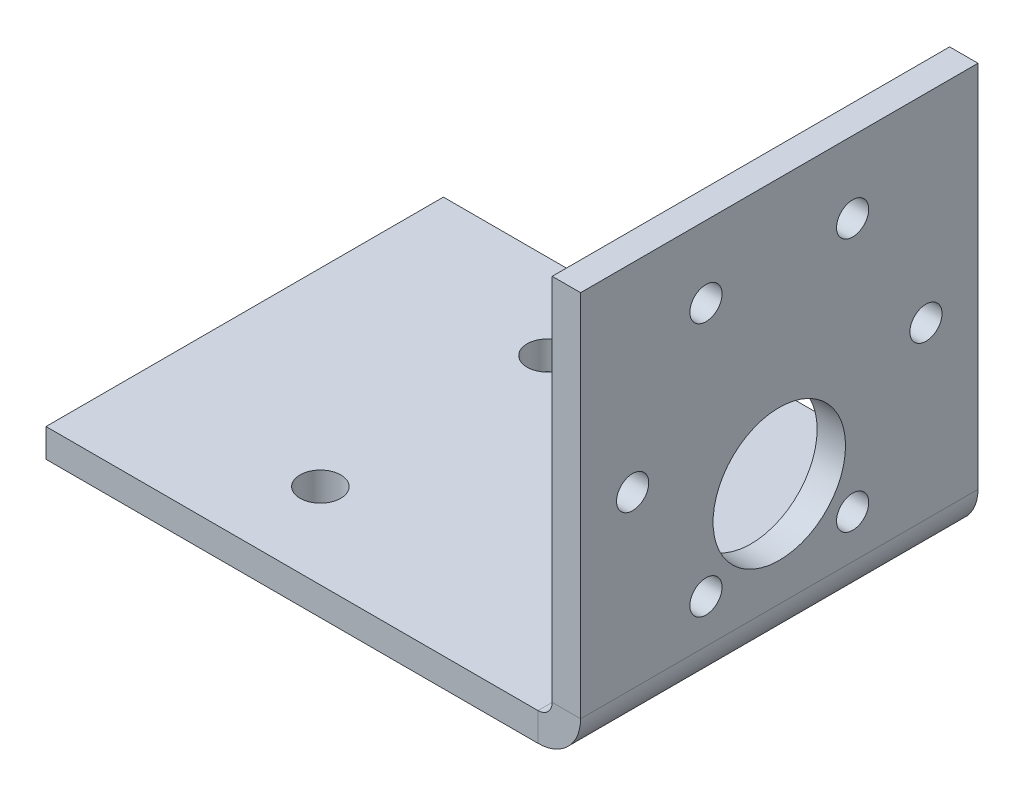
ISO-10303-21;
HEADER;
FILE_DESCRIPTION(('STEP AP214'),'2;1');
FILE_NAME('part.step','',(''),(''),'','','');
FILE_SCHEMA(('AUTOMOTIVE_DESIGN { 1 0 10303 214 1 1 1 1 }'));
ENDSEC;
DATA;
#1=APPLICATION_CONTEXT('core data for automotive mechanical design processes');
#2=APPLICATION_PROTOCOL_DEFINITION('international standard','automotive_design',2000,#1);
#3=PRODUCT_CONTEXT('',#1,'mechanical');
#4=PRODUCT('Part','Part','',(#3));
#5=PRODUCT_RELATED_PRODUCT_CATEGORY('part','',(#4));
#6=PRODUCT_DEFINITION_FORMATION('','',#4);
#7=PRODUCT_DEFINITION_CONTEXT('part definition',#1,'design');
#8=PRODUCT_DEFINITION('design','',#6,#7);
#9=PRODUCT_DEFINITION_SHAPE('','',#8);
#10=(LENGTH_UNIT() NAMED_UNIT(*) SI_UNIT(.MILLI.,.METRE.));
#11=(NAMED_UNIT(*) PLANE_ANGLE_UNIT() SI_UNIT($,.RADIAN.));
#12=(NAMED_UNIT(*) SI_UNIT($,.STERADIAN.) SOLID_ANGLE_UNIT());
#13=UNCERTAINTY_MEASURE_WITH_UNIT(LENGTH_MEASURE(1.E-05),#10,'distance_accuracy_value','');
#14=(GEOMETRIC_REPRESENTATION_CONTEXT(3) GLOBAL_UNCERTAINTY_ASSIGNED_CONTEXT((#13)) GLOBAL_UNIT_ASSIGNED_CONTEXT((#10,
#11,#12)) REPRESENTATION_CONTEXT('',''));
#15=CARTESIAN_POINT('',(0.,0.,0.));
#16=DIRECTION('',(0.,0.,1.));
#17=DIRECTION('',(1.,0.,0.));
#18=AXIS2_PLACEMENT_3D('',#15,#16,#17);
#19=CARTESIAN_POINT('',(0.,-18.,21.));
#20=DIRECTION('',(0.,0.,1.));
#21=DIRECTION('',(1.,0.,0.));
#22=AXIS2_PLACEMENT_3D('',#19,#20,#21);
#23=PLANE('',#22);
#24=DIRECTION('',(1.,0.,0.));
#25=VECTOR('',#24,1.);
#26=CARTESIAN_POINT('',(0.,-18.,21.));
#27=LINE('',#26,#25);
#28=CARTESIAN_POINT('',(0.,-18.,21.));
#29=VERTEX_POINT('',#28);
#30=CARTESIAN_POINT('',(3.,-18.,21.));
#31=VERTEX_POINT('',#30);
#32=EDGE_CURVE('E11',#29,#31,#27,.T.);
#33=ORIENTED_EDGE('',*,*,#32,.F.);
#34=CARTESIAN_POINT('',(-1.5,-18.,21.));
#35=DIRECTION('',(0.,0.,1.));
#36=DIRECTION('',(1.,0.,0.));
#37=AXIS2_PLACEMENT_3D('',#34,#35,#36);
#38=CIRCLE('',#37,1.5);
#39=CARTESIAN_POINT('',(-1.5,-19.5,21.));
#40=VERTEX_POINT('',#39);
#41=EDGE_CURVE('E173',#29,#40,#38,.F.);
#42=ORIENTED_EDGE('',*,*,#41,.T.);
#43=DIRECTION('',(0.,1.,0.));
#44=VECTOR('',#43,1.);
#45=CARTESIAN_POINT('',(-1.5,-22.5,21.));
#46=LINE('',#45,#44);
#47=CARTESIAN_POINT('',(-1.5,-22.5,21.));
#48=VERTEX_POINT('',#47);
#49=EDGE_CURVE('E51',#48,#40,#46,.T.);
#50=ORIENTED_EDGE('',*,*,#49,.F.);
#51=CARTESIAN_POINT('',(-1.5,-18.,21.));
#52=DIRECTION('',(0.,0.,1.));
#53=DIRECTION('',(1.,0.,0.));
#54=AXIS2_PLACEMENT_3D('',#51,#52,#53);
#55=CIRCLE('',#54,4.5);
#56=EDGE_CURVE('E162',#31,#48,#55,.F.);
#57=ORIENTED_EDGE('',*,*,#56,.F.);
#58=EDGE_LOOP('',(#33,#42,#50,#57));
#59=FACE_BOUND('',#58,.T.);
#60=ADVANCED_FACE('F43',(#59),#23,.T.);
#61=CARTESIAN_POINT('',(-1.5,-22.5,21.));
#62=DIRECTION('',(0.,0.,1.));
#63=DIRECTION('',(1.,0.,0.));
#64=AXIS2_PLACEMENT_3D('',#61,#62,#63);
#65=PLANE('',#64);
#66=DIRECTION('',(0.,-1.,0.));
#67=VECTOR('',#66,1.);
#68=CARTESIAN_POINT('',(0.,21.,21.));
#69=LINE('',#68,#67);
#70=CARTESIAN_POINT('',(0.,21.,21.));
#71=VERTEX_POINT('',#70);
#72=EDGE_CURVE('E171',#71,#29,#69,.T.);
#73=ORIENTED_EDGE('',*,*,#72,.T.);
#74=ORIENTED_EDGE('',*,*,#32,.T.);
#75=DIRECTION('',(0.,1.,0.));
#76=VECTOR('',#75,1.);
#77=CARTESIAN_POINT('',(3.,21.,21.));
#78=LINE('',#77,#76);
#79=CARTESIAN_POINT('',(3.,21.,21.));
#80=VERTEX_POINT('',#79);
#81=EDGE_CURVE('E164',#80,#31,#78,.F.);
#82=ORIENTED_EDGE('',*,*,#81,.F.);
#83=DIRECTION('',(1.,0.,0.));
#84=VECTOR('',#83,1.);
#85=CARTESIAN_POINT('',(0.,21.,21.));
#86=LINE('',#85,#84);
#87=EDGE_CURVE('E166',#71,#80,#86,.T.);
#88=ORIENTED_EDGE('',*,*,#87,.F.);
#89=EDGE_LOOP('',(#73,#74,#82,#88));
#90=FACE_BOUND('',#89,.T.);
#91=ADVANCED_FACE('F290',(#90),#65,.T.);
#92=CARTESIAN_POINT('',(-1.5,-19.5,-21.0001));
#93=DIRECTION('',(0.,0.,-1.));
#94=DIRECTION('',(-1.,0.,0.));
#95=AXIS2_PLACEMENT_3D('',#92,#93,#94);
#96=PLANE('',#95);
#97=DIRECTION('',(0.,-1.,0.));
#98=VECTOR('',#97,1.);
#99=CARTESIAN_POINT('',(-1.5,-19.5,-21.0001));
#100=LINE('',#99,#98);
#101=CARTESIAN_POINT('',(-1.5,-19.5,-21.0001));
#102=VERTEX_POINT('',#101);
#103=CARTESIAN_POINT('',(-1.5,-22.5,-21.0001));
#104=VERTEX_POINT('',#103);
#105=EDGE_CURVE('E192',#102,#104,#100,.T.);
#106=ORIENTED_EDGE('',*,*,#105,.F.);
#107=CARTESIAN_POINT('',(-1.5,-18.,-21.0001));
#108=DIRECTION('',(0.,0.,1.));
#109=DIRECTION('',(1.,0.,0.));
#110=AXIS2_PLACEMENT_3D('',#107,#108,#109);
#111=CIRCLE('',#110,1.5);
#112=CARTESIAN_POINT('',(0.,-18.,-21.0001));
#113=VERTEX_POINT('',#112);
#114=EDGE_CURVE('E155',#113,#102,#111,.F.);
#115=ORIENTED_EDGE('',*,*,#114,.F.);
#116=DIRECTION('',(-1.,0.,0.));
#117=VECTOR('',#116,1.);
#118=CARTESIAN_POINT('',(3.,-18.,-21.0001));
#119=LINE('',#118,#117);
#120=CARTESIAN_POINT('',(3.,-18.,-21.0001));
#121=VERTEX_POINT('',#120);
#122=EDGE_CURVE('E116',#121,#113,#119,.T.);
#123=ORIENTED_EDGE('',*,*,#122,.F.);
#124=CARTESIAN_POINT('',(-1.5,-18.,-21.0001));
#125=DIRECTION('',(0.,0.,1.));
#126=DIRECTION('',(1.,0.,0.));
#127=AXIS2_PLACEMENT_3D('',#124,#125,#126);
#128=CIRCLE('',#127,4.5);
#129=EDGE_CURVE('E145',#121,#104,#128,.F.);
#130=ORIENTED_EDGE('',*,*,#129,.T.);
#131=EDGE_LOOP('',(#106,#115,#123,#130));
#132=FACE_BOUND('',#131,.T.);
#133=ADVANCED_FACE('F275',(#132),#96,.T.);
#134=CARTESIAN_POINT('',(3.,-18.,-21.0001));
#135=DIRECTION('',(0.,0.,-1.));
#136=DIRECTION('',(-1.,0.,0.));
#137=AXIS2_PLACEMENT_3D('',#134,#135,#136);
#138=PLANE('',#137);
#139=DIRECTION('',(-1.,0.,0.));
#140=VECTOR('',#139,1.);
#141=CARTESIAN_POINT('',(0.,-19.5,-21.0001));
#142=LINE('',#141,#140);
#143=CARTESIAN_POINT('',(-53.5,-19.5,-21.0001));
#144=VERTEX_POINT('',#143);
#145=EDGE_CURVE('E124',#102,#144,#142,.T.);
#146=ORIENTED_EDGE('',*,*,#145,.F.);
#147=ORIENTED_EDGE('',*,*,#105,.T.);
#148=DIRECTION('',(1.,0.,0.));
#149=VECTOR('',#148,1.);
#150=CARTESIAN_POINT('',(0.,-22.5,-21.0001));
#151=LINE('',#150,#149);
#152=CARTESIAN_POINT('',(-53.5,-22.5,-21.0001));
#153=VERTEX_POINT('',#152);
#154=EDGE_CURVE('E127',#104,#153,#151,.F.);
#155=ORIENTED_EDGE('',*,*,#154,.T.);
#156=DIRECTION('',(0.,1.,0.));
#157=VECTOR('',#156,1.);
#158=CARTESIAN_POINT('',(-53.5,-22.5,-21.0001));
#159=LINE('',#158,#157);
#160=EDGE_CURVE('E109',#153,#144,#159,.T.);
#161=ORIENTED_EDGE('',*,*,#160,.T.);
#162=EDGE_LOOP('',(#146,#147,#155,#161));
#163=FACE_BOUND('',#162,.T.);
#164=ADVANCED_FACE('F125',(#163),#138,.T.);
#165=CARTESIAN_POINT('',(0.,-19.5,21.));
#166=DIRECTION('',(0.,-1.,0.));
#167=DIRECTION('',(0.,0.,-1.));
#168=AXIS2_PLACEMENT_3D('',#165,#166,#167);
#169=PLANE('',#168);
#170=CARTESIAN_POINT('',(-33.5,-19.5,12.));
#171=DIRECTION('',(0.,-1.,0.));
#172=DIRECTION('',(0.,0.,-1.));
#173=AXIS2_PLACEMENT_3D('',#170,#171,#172);
#174=CIRCLE('',#173,2.15);
#175=CARTESIAN_POINT('',(-33.5,-19.5,14.15));
#176=VERTEX_POINT('',#175);
#177=EDGE_CURVE('E204',#176,#176,#174,.T.);
#178=ORIENTED_EDGE('',*,*,#177,.T.);
#179=EDGE_LOOP('',(#178));
#180=FACE_BOUND('',#179,.T.);
#181=CARTESIAN_POINT('',(-33.5,-19.5,-12.));
#182=DIRECTION('',(0.,-1.,0.));
#183=DIRECTION('',(0.,0.,-1.));
#184=AXIS2_PLACEMENT_3D('',#181,#182,#183);
#185=CIRCLE('',#184,2.15);
#186=CARTESIAN_POINT('',(-33.5,-19.5,-9.85));
#187=VERTEX_POINT('',#186);
#188=EDGE_CURVE('E193',#187,#187,#185,.T.);
#189=ORIENTED_EDGE('',*,*,#188,.T.);
#190=EDGE_LOOP('',(#189));
#191=FACE_BOUND('',#190,.T.);
#192=DIRECTION('',(0.,0.,-1.));
#193=VECTOR('',#192,1.);
#194=CARTESIAN_POINT('',(-1.5,-19.5,21.));
#195=LINE('',#194,#193);
#196=EDGE_CURVE('E131',#40,#102,#195,.T.);
#197=ORIENTED_EDGE('',*,*,#196,.T.);
#198=ORIENTED_EDGE('',*,*,#145,.T.);
#199=DIRECTION('',(0.,0.,-1.));
#200=VECTOR('',#199,1.);
#201=CARTESIAN_POINT('',(-53.5,-19.5,21.));
#202=LINE('',#201,#200);
#203=CARTESIAN_POINT('',(-53.5,-19.5,21.));
#204=VERTEX_POINT('',#203);
#205=EDGE_CURVE('E110',#204,#144,#202,.T.);
#206=ORIENTED_EDGE('',*,*,#205,.F.);
#207=DIRECTION('',(-1.,0.,0.));
#208=VECTOR('',#207,1.);
#209=CARTESIAN_POINT('',(0.,-19.5,21.));
#210=LINE('',#209,#208);
#211=EDGE_CURVE('E158',#40,#204,#210,.T.);
#212=ORIENTED_EDGE('',*,*,#211,.F.);
#213=EDGE_LOOP('',(#197,#198,#206,#212));
#214=FACE_BOUND('',#213,.T.);
#215=ADVANCED_FACE('F126',(#180,#191,#214),#169,.F.);
#216=CARTESIAN_POINT('',(-53.5,-22.5,21.));
#217=DIRECTION('',(-1.,0.,0.));
#218=DIRECTION('',(0.,0.,1.));
#219=AXIS2_PLACEMENT_3D('',#216,#217,#218);
#220=PLANE('',#219);
#221=ORIENTED_EDGE('',*,*,#205,.T.);
#222=ORIENTED_EDGE('',*,*,#160,.F.);
#223=DIRECTION('',(0.,0.,-1.));
#224=VECTOR('',#223,1.);
#225=CARTESIAN_POINT('',(-53.5,-22.5,21.));
#226=LINE('',#225,#224);
#227=CARTESIAN_POINT('',(-53.5,-22.5,21.));
#228=VERTEX_POINT('',#227);
#229=EDGE_CURVE('E120',#228,#153,#226,.T.);
#230=ORIENTED_EDGE('',*,*,#229,.F.);
#231=DIRECTION('',(0.,1.,0.));
#232=VECTOR('',#231,1.);
#233=CARTESIAN_POINT('',(-53.5,-22.5,21.));
#234=LINE('',#233,#232);
#235=EDGE_CURVE('E115',#228,#204,#234,.T.);
#236=ORIENTED_EDGE('',*,*,#235,.T.);
#237=EDGE_LOOP('',(#221,#222,#230,#236));
#238=FACE_BOUND('',#237,.T.);
#239=ADVANCED_FACE('F107',(#238),#220,.T.);
#240=CARTESIAN_POINT('',(0.,-22.5,21.));
#241=DIRECTION('',(0.,-1.,0.));
#242=DIRECTION('',(0.,0.,-1.));
#243=AXIS2_PLACEMENT_3D('',#240,#241,#242);
#244=PLANE('',#243);
#245=CARTESIAN_POINT('',(-33.5,-22.5,12.));
#246=DIRECTION('',(0.,-1.,0.));
#247=DIRECTION('',(0.,0.,-1.));
#248=AXIS2_PLACEMENT_3D('',#245,#246,#247);
#249=CIRCLE('',#248,2.15);
#250=CARTESIAN_POINT('',(-33.5,-22.5,14.15));
#251=VERTEX_POINT('',#250);
#252=EDGE_CURVE('E46',#251,#251,#249,.T.);
#253=ORIENTED_EDGE('',*,*,#252,.F.);
#254=EDGE_LOOP('',(#253));
#255=FACE_BOUND('',#254,.T.);
#256=CARTESIAN_POINT('',(-33.5,-22.5,-12.));
#257=DIRECTION('',(0.,-1.,0.));
#258=DIRECTION('',(0.,0.,-1.));
#259=AXIS2_PLACEMENT_3D('',#256,#257,#258);
#260=CIRCLE('',#259,2.15);
#261=CARTESIAN_POINT('',(-33.5,-22.5,-9.85));
#262=VERTEX_POINT('',#261);
#263=EDGE_CURVE('E194',#262,#262,#260,.T.);
#264=ORIENTED_EDGE('',*,*,#263,.F.);
#265=EDGE_LOOP('',(#264));
#266=FACE_BOUND('',#265,.T.);
#267=ORIENTED_EDGE('',*,*,#229,.T.);
#268=ORIENTED_EDGE('',*,*,#154,.F.);
#269=DIRECTION('',(0.,0.,-1.));
#270=VECTOR('',#269,1.);
#271=CARTESIAN_POINT('',(-1.5,-22.5,21.));
#272=LINE('',#271,#270);
#273=EDGE_CURVE('E187',#48,#104,#272,.T.);
#274=ORIENTED_EDGE('',*,*,#273,.F.);
#275=DIRECTION('',(1.,0.,0.));
#276=VECTOR('',#275,1.);
#277=CARTESIAN_POINT('',(0.,-22.5,21.));
#278=LINE('',#277,#276);
#279=EDGE_CURVE('E159',#48,#228,#278,.F.);
#280=ORIENTED_EDGE('',*,*,#279,.T.);
#281=EDGE_LOOP('',(#267,#268,#274,#280));
#282=FACE_BOUND('',#281,.T.);
#283=ADVANCED_FACE('F273',(#255,#266,#282),#244,.T.);
#284=CARTESIAN_POINT('',(-1.5,-18.,21.));
#285=DIRECTION('',(0.,0.,-1.));
#286=DIRECTION('',(-1.,0.,0.));
#287=AXIS2_PLACEMENT_3D('',#284,#285,#286);
#288=CYLINDRICAL_SURFACE('',#287,4.5);
#289=ORIENTED_EDGE('',*,*,#273,.T.);
#290=ORIENTED_EDGE('',*,*,#129,.F.);
#291=DIRECTION('',(0.,0.,-1.));
#292=VECTOR('',#291,1.);
#293=CARTESIAN_POINT('',(3.,-18.,21.));
#294=LINE('',#293,#292);
#295=EDGE_CURVE('E182',#31,#121,#294,.T.);
#296=ORIENTED_EDGE('',*,*,#295,.F.);
#297=ORIENTED_EDGE('',*,*,#56,.T.);
#298=EDGE_LOOP('',(#289,#290,#296,#297));
#299=FACE_BOUND('',#298,.T.);
#300=ADVANCED_FACE('F255',(#299),#288,.T.);
#301=CARTESIAN_POINT('',(3.,21.,21.));
#302=DIRECTION('',(1.,0.,0.));
#303=DIRECTION('',(0.,0.,-1.));
#304=AXIS2_PLACEMENT_3D('',#301,#302,#303);
#305=PLANE('',#304);
#306=CARTESIAN_POINT('',(3.,0.,15.5));
#307=DIRECTION('',(1.,0.,0.));
#308=DIRECTION('',(0.,0.,-1.));
#309=AXIS2_PLACEMENT_3D('',#306,#307,#308);
#310=CIRCLE('',#309,1.7);
#311=CARTESIAN_POINT('',(3.,0.,13.8));
#312=VERTEX_POINT('',#311);
#313=EDGE_CURVE('E132',#312,#312,#310,.T.);
#314=ORIENTED_EDGE('',*,*,#313,.F.);
#315=EDGE_LOOP('',(#314));
#316=FACE_BOUND('',#315,.T.);
#317=CARTESIAN_POINT('',(3.,-13.4233937586588,7.75));
#318=DIRECTION('',(1.,0.,0.));
#319=DIRECTION('',(0.,0.,-1.));
#320=AXIS2_PLACEMENT_3D('',#317,#318,#319);
#321=CIRCLE('',#320,1.7);
#322=CARTESIAN_POINT('',(3.,-13.4233937586588,6.05));
#323=VERTEX_POINT('',#322);
#324=EDGE_CURVE('E211',#323,#323,#321,.T.);
#325=ORIENTED_EDGE('',*,*,#324,.F.);
#326=EDGE_LOOP('',(#325));
#327=FACE_BOUND('',#326,.T.);
#328=CARTESIAN_POINT('',(3.,-7.,0.));
#329=DIRECTION('',(1.,0.,0.));
#330=DIRECTION('',(0.,0.,-1.));
#331=AXIS2_PLACEMENT_3D('',#328,#329,#330);
#332=CIRCLE('',#331,7.);
#333=CARTESIAN_POINT('',(3.,-7.,-7.));
#334=VERTEX_POINT('',#333);
#335=EDGE_CURVE('E207',#334,#334,#332,.T.);
#336=ORIENTED_EDGE('',*,*,#335,.F.);
#337=EDGE_LOOP('',(#336));
#338=FACE_BOUND('',#337,.T.);
#339=CARTESIAN_POINT('',(3.,-13.4233937586588,-7.75000000000001));
#340=DIRECTION('',(1.,0.,0.));
#341=DIRECTION('',(0.,0.,-1.));
#342=AXIS2_PLACEMENT_3D('',#339,#340,#341);
#343=CIRCLE('',#342,1.7);
#344=CARTESIAN_POINT('',(3.,-13.4233937586588,-9.45000000000001));
#345=VERTEX_POINT('',#344);
#346=EDGE_CURVE('E139',#345,#345,#343,.T.);
#347=ORIENTED_EDGE('',*,*,#346,.F.);
#348=EDGE_LOOP('',(#347));
#349=FACE_BOUND('',#348,.T.);
#350=CARTESIAN_POINT('',(3.,0.,-15.5));
#351=DIRECTION('',(1.,0.,0.));
#352=DIRECTION('',(0.,0.,-1.));
#353=AXIS2_PLACEMENT_3D('',#350,#351,#352);
#354=CIRCLE('',#353,1.7);
#355=CARTESIAN_POINT('',(3.,0.,-17.2));
#356=VERTEX_POINT('',#355);
#357=EDGE_CURVE('E236',#356,#356,#354,.T.);
#358=ORIENTED_EDGE('',*,*,#357,.F.);
#359=EDGE_LOOP('',(#358));
#360=FACE_BOUND('',#359,.T.);
#361=CARTESIAN_POINT('',(3.,13.4233937586588,-7.75));
#362=DIRECTION('',(1.,0.,0.));
#363=DIRECTION('',(0.,0.,-1.));
#364=AXIS2_PLACEMENT_3D('',#361,#362,#363);
#365=CIRCLE('',#364,1.7);
#366=CARTESIAN_POINT('',(3.,13.4233937586588,-9.45));
#367=VERTEX_POINT('',#366);
#368=EDGE_CURVE('E229',#367,#367,#365,.T.);
#369=ORIENTED_EDGE('',*,*,#368,.F.);
#370=EDGE_LOOP('',(#369));
#371=FACE_BOUND('',#370,.T.);
#372=CARTESIAN_POINT('',(3.,13.4233937586588,7.75));
#373=DIRECTION('',(1.,0.,0.));
#374=DIRECTION('',(0.,0.,-1.));
#375=AXIS2_PLACEMENT_3D('',#372,#373,#374);
#376=CIRCLE('',#375,1.7);
#377=CARTESIAN_POINT('',(3.,13.4233937586588,6.05));
#378=VERTEX_POINT('',#377);
#379=EDGE_CURVE('E224',#378,#378,#376,.T.);
#380=ORIENTED_EDGE('',*,*,#379,.F.);
#381=EDGE_LOOP('',(#380));
#382=FACE_BOUND('',#381,.T.);
#383=ORIENTED_EDGE('',*,*,#295,.T.);
#384=DIRECTION('',(0.,1.,0.));
#385=VECTOR('',#384,1.);
#386=CARTESIAN_POINT('',(3.,21.,-21.0001));
#387=LINE('',#386,#385);
#388=CARTESIAN_POINT('',(3.,21.,-21.0001));
#389=VERTEX_POINT('',#388);
#390=EDGE_CURVE('E143',#389,#121,#387,.F.);
#391=ORIENTED_EDGE('',*,*,#390,.F.);
#392=DIRECTION('',(0.,0.,-1.));
#393=VECTOR('',#392,1.);
#394=CARTESIAN_POINT('',(3.,21.,21.));
#395=LINE('',#394,#393);
#396=EDGE_CURVE('E181',#80,#389,#395,.T.);
#397=ORIENTED_EDGE('',*,*,#396,.F.);
#398=ORIENTED_EDGE('',*,*,#81,.T.);
#399=EDGE_LOOP('',(#383,#391,#397,#398));
#400=FACE_BOUND('',#399,.T.);
#401=ADVANCED_FACE('F247',(#316,#327,#338,#349,#360,#371,#382,#400),#305,.T.);
#402=CARTESIAN_POINT('',(0.,21.,21.));
#403=DIRECTION('',(0.,1.,0.));
#404=DIRECTION('',(0.,0.,1.));
#405=AXIS2_PLACEMENT_3D('',#402,#403,#404);
#406=PLANE('',#405);
#407=ORIENTED_EDGE('',*,*,#396,.T.);
#408=DIRECTION('',(1.,0.,0.));
#409=VECTOR('',#408,1.);
#410=CARTESIAN_POINT('',(0.,21.,-21.0001));
#411=LINE('',#410,#409);
#412=CARTESIAN_POINT('',(0.,21.,-21.0001));
#413=VERTEX_POINT('',#412);
#414=EDGE_CURVE('E149',#413,#389,#411,.T.);
#415=ORIENTED_EDGE('',*,*,#414,.F.);
#416=DIRECTION('',(0.,0.,-1.));
#417=VECTOR('',#416,1.);
#418=CARTESIAN_POINT('',(0.,21.,21.));
#419=LINE('',#418,#417);
#420=EDGE_CURVE('E177',#71,#413,#419,.T.);
#421=ORIENTED_EDGE('',*,*,#420,.F.);
#422=ORIENTED_EDGE('',*,*,#87,.T.);
#423=EDGE_LOOP('',(#407,#415,#421,#422));
#424=FACE_BOUND('',#423,.T.);
#425=ADVANCED_FACE('F252',(#424),#406,.T.);
#426=CARTESIAN_POINT('',(0.,21.,21.));
#427=DIRECTION('',(1.,0.,0.));
#428=DIRECTION('',(0.,0.,-1.));
#429=AXIS2_PLACEMENT_3D('',#426,#427,#428);
#430=PLANE('',#429);
#431=CARTESIAN_POINT('',(0.,0.,15.5));
#432=DIRECTION('',(1.,0.,0.));
#433=DIRECTION('',(0.,0.,-1.));
#434=AXIS2_PLACEMENT_3D('',#431,#432,#433);
#435=CIRCLE('',#434,1.7);
#436=CARTESIAN_POINT('',(0.,0.,13.8));
#437=VERTEX_POINT('',#436);
#438=EDGE_CURVE('E135',#437,#437,#435,.T.);
#439=ORIENTED_EDGE('',*,*,#438,.T.);
#440=EDGE_LOOP('',(#439));
#441=FACE_BOUND('',#440,.T.);
#442=CARTESIAN_POINT('',(0.,-13.4233937586588,7.75));
#443=DIRECTION('',(1.,0.,0.));
#444=DIRECTION('',(0.,0.,-1.));
#445=AXIS2_PLACEMENT_3D('',#442,#443,#444);
#446=CIRCLE('',#445,1.7);
#447=CARTESIAN_POINT('',(0.,-13.4233937586588,6.05));
#448=VERTEX_POINT('',#447);
#449=EDGE_CURVE('E219',#448,#448,#446,.T.);
#450=ORIENTED_EDGE('',*,*,#449,.T.);
#451=EDGE_LOOP('',(#450));
#452=FACE_BOUND('',#451,.T.);
#453=CARTESIAN_POINT('',(0.,-7.,0.));
#454=DIRECTION('',(1.,0.,0.));
#455=DIRECTION('',(0.,0.,-1.));
#456=AXIS2_PLACEMENT_3D('',#453,#454,#455);
#457=CIRCLE('',#456,7.);
#458=CARTESIAN_POINT('',(0.,-7.,-7.));
#459=VERTEX_POINT('',#458);
#460=EDGE_CURVE('E212',#459,#459,#457,.T.);
#461=ORIENTED_EDGE('',*,*,#460,.T.);
#462=EDGE_LOOP('',(#461));
#463=FACE_BOUND('',#462,.T.);
#464=CARTESIAN_POINT('',(0.,-13.4233937586588,-7.75000000000001));
#465=DIRECTION('',(1.,0.,0.));
#466=DIRECTION('',(0.,0.,-1.));
#467=AXIS2_PLACEMENT_3D('',#464,#465,#466);
#468=CIRCLE('',#467,1.7);
#469=CARTESIAN_POINT('',(0.,-13.4233937586588,-9.45000000000001));
#470=VERTEX_POINT('',#469);
#471=EDGE_CURVE('E238',#470,#470,#468,.T.);
#472=ORIENTED_EDGE('',*,*,#471,.T.);
#473=EDGE_LOOP('',(#472));
#474=FACE_BOUND('',#473,.T.);
#475=CARTESIAN_POINT('',(0.,0.,-15.5));
#476=DIRECTION('',(1.,0.,0.));
#477=DIRECTION('',(0.,0.,-1.));
#478=AXIS2_PLACEMENT_3D('',#475,#476,#477);
#479=CIRCLE('',#478,1.7);
#480=CARTESIAN_POINT('',(0.,0.,-17.2));
#481=VERTEX_POINT('',#480);
#482=EDGE_CURVE('E231',#481,#481,#479,.T.);
#483=ORIENTED_EDGE('',*,*,#482,.T.);
#484=EDGE_LOOP('',(#483));
#485=FACE_BOUND('',#484,.T.);
#486=CARTESIAN_POINT('',(0.,13.4233937586588,-7.75));
#487=DIRECTION('',(1.,0.,0.));
#488=DIRECTION('',(0.,0.,-1.));
#489=AXIS2_PLACEMENT_3D('',#486,#487,#488);
#490=CIRCLE('',#489,1.7);
#491=CARTESIAN_POINT('',(0.,13.4233937586588,-9.45));
#492=VERTEX_POINT('',#491);
#493=EDGE_CURVE('E227',#492,#492,#490,.T.);
#494=ORIENTED_EDGE('',*,*,#493,.T.);
#495=EDGE_LOOP('',(#494));
#496=FACE_BOUND('',#495,.T.);
#497=CARTESIAN_POINT('',(0.,13.4233937586588,7.75));
#498=DIRECTION('',(1.,0.,0.));
#499=DIRECTION('',(0.,0.,-1.));
#500=AXIS2_PLACEMENT_3D('',#497,#498,#499);
#501=CIRCLE('',#500,1.7);
#502=CARTESIAN_POINT('',(0.,13.4233937586588,6.05));
#503=VERTEX_POINT('',#502);
#504=EDGE_CURVE('E208',#503,#503,#501,.T.);
#505=ORIENTED_EDGE('',*,*,#504,.T.);
#506=EDGE_LOOP('',(#505));
#507=FACE_BOUND('',#506,.T.);
#508=ORIENTED_EDGE('',*,*,#420,.T.);
#509=DIRECTION('',(0.,-1.,0.));
#510=VECTOR('',#509,1.);
#511=CARTESIAN_POINT('',(0.,21.,-21.0001));
#512=LINE('',#511,#510);
#513=EDGE_CURVE('E153',#413,#113,#512,.T.);
#514=ORIENTED_EDGE('',*,*,#513,.T.);
#515=DIRECTION('',(0.,0.,-1.));
#516=VECTOR('',#515,1.);
#517=CARTESIAN_POINT('',(0.,-18.,21.));
#518=LINE('',#517,#516);
#519=EDGE_CURVE('E176',#29,#113,#518,.T.);
#520=ORIENTED_EDGE('',*,*,#519,.F.);
#521=ORIENTED_EDGE('',*,*,#72,.F.);
#522=EDGE_LOOP('',(#508,#514,#520,#521));
#523=FACE_BOUND('',#522,.T.);
#524=ADVANCED_FACE('F282',(#441,#452,#463,#474,#485,#496,#507,#523),#430,.F.);
#525=CARTESIAN_POINT('',(-1.5,-18.,21.));
#526=DIRECTION('',(0.,0.,-1.));
#527=DIRECTION('',(-1.,0.,0.));
#528=AXIS2_PLACEMENT_3D('',#525,#526,#527);
#529=CYLINDRICAL_SURFACE('',#528,1.5);
#530=ORIENTED_EDGE('',*,*,#519,.T.);
#531=ORIENTED_EDGE('',*,*,#114,.T.);
#532=ORIENTED_EDGE('',*,*,#196,.F.);
#533=ORIENTED_EDGE('',*,*,#41,.F.);
#534=EDGE_LOOP('',(#530,#531,#532,#533));
#535=FACE_BOUND('',#534,.T.);
#536=ADVANCED_FACE('F276',(#535),#529,.F.);
#537=CARTESIAN_POINT('',(-1.5,-18.,21.));
#538=DIRECTION('',(0.,0.,1.));
#539=DIRECTION('',(1.,0.,0.));
#540=AXIS2_PLACEMENT_3D('',#537,#538,#539);
#541=PLANE('',#540);
#542=ORIENTED_EDGE('',*,*,#211,.T.);
#543=ORIENTED_EDGE('',*,*,#235,.F.);
#544=ORIENTED_EDGE('',*,*,#279,.F.);
#545=ORIENTED_EDGE('',*,*,#49,.T.);
#546=EDGE_LOOP('',(#542,#543,#544,#545));
#547=FACE_BOUND('',#546,.T.);
#548=ADVANCED_FACE('F277',(#547),#541,.T.);
#549=CARTESIAN_POINT('',(-1.5,-18.,-21.0001));
#550=DIRECTION('',(0.,0.,1.));
#551=DIRECTION('',(1.,0.,0.));
#552=AXIS2_PLACEMENT_3D('',#549,#550,#551);
#553=PLANE('',#552);
#554=ORIENTED_EDGE('',*,*,#390,.T.);
#555=ORIENTED_EDGE('',*,*,#122,.T.);
#556=ORIENTED_EDGE('',*,*,#513,.F.);
#557=ORIENTED_EDGE('',*,*,#414,.T.);
#558=EDGE_LOOP('',(#554,#555,#556,#557));
#559=FACE_BOUND('',#558,.T.);
#560=ADVANCED_FACE('F267',(#559),#553,.F.);
#561=CARTESIAN_POINT('',(3.,13.4233937586588,7.75));
#562=DIRECTION('',(-1.,0.,0.));
#563=DIRECTION('',(0.,0.,1.));
#564=AXIS2_PLACEMENT_3D('',#561,#562,#563);
#565=CYLINDRICAL_SURFACE('',#564,1.7);
#566=ORIENTED_EDGE('',*,*,#379,.T.);
#567=EDGE_LOOP('',(#566));
#568=FACE_BOUND('',#567,.T.);
#569=ORIENTED_EDGE('',*,*,#504,.F.);
#570=EDGE_LOOP('',(#569));
#571=FACE_BOUND('',#570,.T.);
#572=ADVANCED_FACE('F319',(#568,#571),#565,.F.);
#573=CARTESIAN_POINT('',(3.,13.4233937586588,-7.75));
#574=DIRECTION('',(-1.,0.,0.));
#575=DIRECTION('',(0.,0.,1.));
#576=AXIS2_PLACEMENT_3D('',#573,#574,#575);
#577=CYLINDRICAL_SURFACE('',#576,1.7);
#578=ORIENTED_EDGE('',*,*,#368,.T.);
#579=EDGE_LOOP('',(#578));
#580=FACE_BOUND('',#579,.T.);
#581=ORIENTED_EDGE('',*,*,#493,.F.);
#582=EDGE_LOOP('',(#581));
#583=FACE_BOUND('',#582,.T.);
#584=ADVANCED_FACE('F323',(#580,#583),#577,.F.);
#585=CARTESIAN_POINT('',(3.,0.,-15.5));
#586=DIRECTION('',(-1.,0.,0.));
#587=DIRECTION('',(0.,0.,1.));
#588=AXIS2_PLACEMENT_3D('',#585,#586,#587);
#589=CYLINDRICAL_SURFACE('',#588,1.7);
#590=ORIENTED_EDGE('',*,*,#357,.T.);
#591=EDGE_LOOP('',(#590));
#592=FACE_BOUND('',#591,.T.);
#593=ORIENTED_EDGE('',*,*,#482,.F.);
#594=EDGE_LOOP('',(#593));
#595=FACE_BOUND('',#594,.T.);
#596=ADVANCED_FACE('F325',(#592,#595),#589,.F.);
#597=CARTESIAN_POINT('',(3.,-13.4233937586588,-7.75000000000001));
#598=DIRECTION('',(-1.,0.,0.));
#599=DIRECTION('',(0.,0.,1.));
#600=AXIS2_PLACEMENT_3D('',#597,#598,#599);
#601=CYLINDRICAL_SURFACE('',#600,1.7);
#602=ORIENTED_EDGE('',*,*,#346,.T.);
#603=EDGE_LOOP('',(#602));
#604=FACE_BOUND('',#603,.T.);
#605=ORIENTED_EDGE('',*,*,#471,.F.);
#606=EDGE_LOOP('',(#605));
#607=FACE_BOUND('',#606,.T.);
#608=ADVANCED_FACE('F244',(#604,#607),#601,.F.);
#609=CARTESIAN_POINT('',(3.,-7.,0.));
#610=DIRECTION('',(-1.,0.,0.));
#611=DIRECTION('',(0.,0.,1.));
#612=AXIS2_PLACEMENT_3D('',#609,#610,#611);
#613=CYLINDRICAL_SURFACE('',#612,7.);
#614=ORIENTED_EDGE('',*,*,#335,.T.);
#615=EDGE_LOOP('',(#614));
#616=FACE_BOUND('',#615,.T.);
#617=ORIENTED_EDGE('',*,*,#460,.F.);
#618=EDGE_LOOP('',(#617));
#619=FACE_BOUND('',#618,.T.);
#620=ADVANCED_FACE('F322',(#616,#619),#613,.F.);
#621=CARTESIAN_POINT('',(3.,-13.4233937586588,7.75));
#622=DIRECTION('',(-1.,0.,0.));
#623=DIRECTION('',(0.,0.,1.));
#624=AXIS2_PLACEMENT_3D('',#621,#622,#623);
#625=CYLINDRICAL_SURFACE('',#624,1.7);
#626=ORIENTED_EDGE('',*,*,#324,.T.);
#627=EDGE_LOOP('',(#626));
#628=FACE_BOUND('',#627,.T.);
#629=ORIENTED_EDGE('',*,*,#449,.F.);
#630=EDGE_LOOP('',(#629));
#631=FACE_BOUND('',#630,.T.);
#632=ADVANCED_FACE('F334',(#628,#631),#625,.F.);
#633=CARTESIAN_POINT('',(3.,0.,15.5));
#634=DIRECTION('',(-1.,0.,0.));
#635=DIRECTION('',(0.,0.,1.));
#636=AXIS2_PLACEMENT_3D('',#633,#634,#635);
#637=CYLINDRICAL_SURFACE('',#636,1.7);
#638=ORIENTED_EDGE('',*,*,#313,.T.);
#639=EDGE_LOOP('',(#638));
#640=FACE_BOUND('',#639,.T.);
#641=ORIENTED_EDGE('',*,*,#438,.F.);
#642=EDGE_LOOP('',(#641));
#643=FACE_BOUND('',#642,.T.);
#644=ADVANCED_FACE('F337',(#640,#643),#637,.F.);
#645=CARTESIAN_POINT('',(-33.5,-30.,-12.));
#646=DIRECTION('',(0.,1.,0.));
#647=DIRECTION('',(0.,0.,1.));
#648=AXIS2_PLACEMENT_3D('',#645,#646,#647);
#649=CYLINDRICAL_SURFACE('',#648,2.15);
#650=CARTESIAN_POINT('',(-33.5,-22.5,-9.85));
#651=CARTESIAN_POINT('',(-33.5,-22.46875,-9.85));
#652=CARTESIAN_POINT('',(-33.5,-22.4375,-9.85));
#653=CARTESIAN_POINT('',(-33.5,-22.375,-9.85));
#654=CARTESIAN_POINT('',(-33.5,-22.34375,-9.85));
#655=CARTESIAN_POINT('',(-33.5,-22.28125,-9.85));
#656=CARTESIAN_POINT('',(-33.5,-22.25,-9.85));
#657=CARTESIAN_POINT('',(-33.5,-22.1875,-9.85));
#658=CARTESIAN_POINT('',(-33.5,-22.15625,-9.85));
#659=CARTESIAN_POINT('',(-33.5,-22.09375,-9.85));
#660=CARTESIAN_POINT('',(-33.5,-22.0625,-9.85));
#661=CARTESIAN_POINT('',(-33.5,-22.,-9.85));
#662=CARTESIAN_POINT('',(-33.5,-21.96875,-9.85));
#663=CARTESIAN_POINT('',(-33.5,-21.90625,-9.85));
#664=CARTESIAN_POINT('',(-33.5,-21.875,-9.85));
#665=CARTESIAN_POINT('',(-33.5,-21.8125,-9.85));
#666=CARTESIAN_POINT('',(-33.5,-21.78125,-9.85));
#667=CARTESIAN_POINT('',(-33.5,-21.71875,-9.85));
#668=CARTESIAN_POINT('',(-33.5,-21.6875,-9.85));
#669=CARTESIAN_POINT('',(-33.5,-21.625,-9.85));
#670=CARTESIAN_POINT('',(-33.5,-21.59375,-9.85));
#671=CARTESIAN_POINT('',(-33.5,-21.53125,-9.85));
#672=CARTESIAN_POINT('',(-33.5,-21.5,-9.85));
#673=CARTESIAN_POINT('',(-33.5,-21.4375,-9.85));
#674=CARTESIAN_POINT('',(-33.5,-21.40625,-9.85));
#675=CARTESIAN_POINT('',(-33.5,-21.34375,-9.85));
#676=CARTESIAN_POINT('',(-33.5,-21.3125,-9.85));
#677=CARTESIAN_POINT('',(-33.5,-21.25,-9.85));
#678=CARTESIAN_POINT('',(-33.5,-21.21875,-9.85));
#679=CARTESIAN_POINT('',(-33.5,-21.15625,-9.85));
#680=CARTESIAN_POINT('',(-33.5,-21.125,-9.85));
#681=CARTESIAN_POINT('',(-33.5,-21.0625,-9.85));
#682=CARTESIAN_POINT('',(-33.5,-21.03125,-9.85));
#683=CARTESIAN_POINT('',(-33.5,-20.96875,-9.85));
#684=CARTESIAN_POINT('',(-33.5,-20.9375,-9.85));
#685=CARTESIAN_POINT('',(-33.5,-20.875,-9.85));
#686=CARTESIAN_POINT('',(-33.5,-20.84375,-9.85));
#687=CARTESIAN_POINT('',(-33.5,-20.78125,-9.85));
#688=CARTESIAN_POINT('',(-33.5,-20.75,-9.85));
#689=CARTESIAN_POINT('',(-33.5,-20.6875,-9.85));
#690=CARTESIAN_POINT('',(-33.5,-20.65625,-9.85));
#691=CARTESIAN_POINT('',(-33.5,-20.59375,-9.85));
#692=CARTESIAN_POINT('',(-33.5,-20.5625,-9.85));
#693=CARTESIAN_POINT('',(-33.5,-20.5,-9.85));
#694=CARTESIAN_POINT('',(-33.5,-20.46875,-9.85));
#695=CARTESIAN_POINT('',(-33.5,-20.40625,-9.85));
#696=CARTESIAN_POINT('',(-33.5,-20.375,-9.85));
#697=CARTESIAN_POINT('',(-33.5,-20.3125,-9.85));
#698=CARTESIAN_POINT('',(-33.5,-20.28125,-9.85));
#699=CARTESIAN_POINT('',(-33.5,-20.21875,-9.85));
#700=CARTESIAN_POINT('',(-33.5,-20.1875,-9.85));
#701=CARTESIAN_POINT('',(-33.5,-20.125,-9.85));
#702=CARTESIAN_POINT('',(-33.5,-20.09375,-9.85));
#703=CARTESIAN_POINT('',(-33.5,-20.03125,-9.85));
#704=CARTESIAN_POINT('',(-33.5,-20.,-9.85));
#705=CARTESIAN_POINT('',(-33.5,-19.9375,-9.85));
#706=CARTESIAN_POINT('',(-33.5,-19.90625,-9.85));
#707=CARTESIAN_POINT('',(-33.5,-19.84375,-9.85));
#708=CARTESIAN_POINT('',(-33.5,-19.8125,-9.85));
#709=CARTESIAN_POINT('',(-33.5,-19.75,-9.85));
#710=CARTESIAN_POINT('',(-33.5,-19.71875,-9.85));
#711=CARTESIAN_POINT('',(-33.5,-19.65625,-9.85));
#712=CARTESIAN_POINT('',(-33.5,-19.625,-9.85));
#713=CARTESIAN_POINT('',(-33.5,-19.5625,-9.85));
#714=CARTESIAN_POINT('',(-33.5,-19.53125,-9.85));
#715=CARTESIAN_POINT('',(-33.5,-19.5,-9.85));
#716=B_SPLINE_CURVE_WITH_KNOTS('',3,(#650,#651,#652,#653,#654,#655,#656,#657,#658,#659,#660,
#661,#662,#663,#664,#665,#666,#667,#668,#669,#670,#671,#672,#673,#674,#675,#676,#677,#678,#679,
#680,#681,#682,#683,#684,#685,#686,#687,#688,#689,#690,#691,#692,#693,#694,#695,#696,#697,#698,
#699,#700,#701,#702,#703,#704,#705,#706,#707,#708,#709,#710,#711,#712,#713,#714,#715),
.UNSPECIFIED.,.F.,.F.,(4,2,2,2,2,2,2,2,2,2,2,2,2,2,2,2,2,2,2,2,2,2,2,2,2,2,2,2,2,2,2,2,4),(0.,
0.0937500000000036,0.1875,0.28125,0.375,0.468750000000004,0.5625,0.656250000000001,
0.750000000000001,0.843750000000001,0.937500000000001,1.03125,1.125,1.21875,1.3125,1.40625,1.5,
1.59375,1.6875,1.78125,1.875,1.96875,2.0625,2.15625,2.25,2.34375,2.4375,2.53125,2.625,2.71875,
2.8125,2.90625,3.),.UNSPECIFIED.);
#717=EDGE_CURVE('BSEAM344',#262,#187,#716,.T.);
#718=ORIENTED_EDGE('',*,*,#263,.T.);
#719=ORIENTED_EDGE('',*,*,#188,.F.);
#720=ORIENTED_EDGE('',*,*,#717,.T.);
#721=ORIENTED_EDGE('',*,*,#717,.F.);
#722=EDGE_LOOP('',(#718,#720,#719,#721));
#723=FACE_BOUND('',#722,.T.);
#724=ADVANCED_FACE('F344',(#723),#649,.F.);
#725=CARTESIAN_POINT('',(-33.5,-30.,12.));
#726=DIRECTION('',(0.,1.,0.));
#727=DIRECTION('',(0.,0.,1.));
#728=AXIS2_PLACEMENT_3D('',#725,#726,#727);
#729=CYLINDRICAL_SURFACE('',#728,2.15);
#730=CARTESIAN_POINT('',(-33.5,-22.5,14.15));
#731=CARTESIAN_POINT('',(-33.5,-22.46875,14.15));
#732=CARTESIAN_POINT('',(-33.5,-22.4375,14.15));
#733=CARTESIAN_POINT('',(-33.5,-22.375,14.15));
#734=CARTESIAN_POINT('',(-33.5,-22.34375,14.15));
#735=CARTESIAN_POINT('',(-33.5,-22.28125,14.15));
#736=CARTESIAN_POINT('',(-33.5,-22.25,14.15));
#737=CARTESIAN_POINT('',(-33.5,-22.1875,14.15));
#738=CARTESIAN_POINT('',(-33.5,-22.15625,14.15));
#739=CARTESIAN_POINT('',(-33.5,-22.09375,14.15));
#740=CARTESIAN_POINT('',(-33.5,-22.0625,14.15));
#741=CARTESIAN_POINT('',(-33.5,-22.,14.15));
#742=CARTESIAN_POINT('',(-33.5,-21.96875,14.15));
#743=CARTESIAN_POINT('',(-33.5,-21.90625,14.15));
#744=CARTESIAN_POINT('',(-33.5,-21.875,14.15));
#745=CARTESIAN_POINT('',(-33.5,-21.8125,14.15));
#746=CARTESIAN_POINT('',(-33.5,-21.78125,14.15));
#747=CARTESIAN_POINT('',(-33.5,-21.71875,14.15));
#748=CARTESIAN_POINT('',(-33.5,-21.6875,14.15));
#749=CARTESIAN_POINT('',(-33.5,-21.625,14.15));
#750=CARTESIAN_POINT('',(-33.5,-21.59375,14.15));
#751=CARTESIAN_POINT('',(-33.5,-21.53125,14.15));
#752=CARTESIAN_POINT('',(-33.5,-21.5,14.15));
#753=CARTESIAN_POINT('',(-33.5,-21.4375,14.15));
#754=CARTESIAN_POINT('',(-33.5,-21.40625,14.15));
#755=CARTESIAN_POINT('',(-33.5,-21.34375,14.15));
#756=CARTESIAN_POINT('',(-33.5,-21.3125,14.15));
#757=CARTESIAN_POINT('',(-33.5,-21.25,14.15));
#758=CARTESIAN_POINT('',(-33.5,-21.21875,14.15));
#759=CARTESIAN_POINT('',(-33.5,-21.15625,14.15));
#760=CARTESIAN_POINT('',(-33.5,-21.125,14.15));
#761=CARTESIAN_POINT('',(-33.5,-21.0625,14.15));
#762=CARTESIAN_POINT('',(-33.5,-21.03125,14.15));
#763=CARTESIAN_POINT('',(-33.5,-20.96875,14.15));
#764=CARTESIAN_POINT('',(-33.5,-20.9375,14.15));
#765=CARTESIAN_POINT('',(-33.5,-20.875,14.15));
#766=CARTESIAN_POINT('',(-33.5,-20.84375,14.15));
#767=CARTESIAN_POINT('',(-33.5,-20.78125,14.15));
#768=CARTESIAN_POINT('',(-33.5,-20.75,14.15));
#769=CARTESIAN_POINT('',(-33.5,-20.6875,14.15));
#770=CARTESIAN_POINT('',(-33.5,-20.65625,14.15));
#771=CARTESIAN_POINT('',(-33.5,-20.59375,14.15));
#772=CARTESIAN_POINT('',(-33.5,-20.5625,14.15));
#773=CARTESIAN_POINT('',(-33.5,-20.5,14.15));
#774=CARTESIAN_POINT('',(-33.5,-20.46875,14.15));
#775=CARTESIAN_POINT('',(-33.5,-20.40625,14.15));
#776=CARTESIAN_POINT('',(-33.5,-20.375,14.15));
#777=CARTESIAN_POINT('',(-33.5,-20.3125,14.15));
#778=CARTESIAN_POINT('',(-33.5,-20.28125,14.15));
#779=CARTESIAN_POINT('',(-33.5,-20.21875,14.15));
#780=CARTESIAN_POINT('',(-33.5,-20.1875,14.15));
#781=CARTESIAN_POINT('',(-33.5,-20.125,14.15));
#782=CARTESIAN_POINT('',(-33.5,-20.09375,14.15));
#783=CARTESIAN_POINT('',(-33.5,-20.03125,14.15));
#784=CARTESIAN_POINT('',(-33.5,-20.,14.15));
#785=CARTESIAN_POINT('',(-33.5,-19.9375,14.15));
#786=CARTESIAN_POINT('',(-33.5,-19.90625,14.15));
#787=CARTESIAN_POINT('',(-33.5,-19.84375,14.15));
#788=CARTESIAN_POINT('',(-33.5,-19.8125,14.15));
#789=CARTESIAN_POINT('',(-33.5,-19.75,14.15));
#790=CARTESIAN_POINT('',(-33.5,-19.71875,14.15));
#791=CARTESIAN_POINT('',(-33.5,-19.65625,14.15));
#792=CARTESIAN_POINT('',(-33.5,-19.625,14.15));
#793=CARTESIAN_POINT('',(-33.5,-19.5625,14.15));
#794=CARTESIAN_POINT('',(-33.5,-19.53125,14.15));
#795=CARTESIAN_POINT('',(-33.5,-19.5,14.15));
#796=B_SPLINE_CURVE_WITH_KNOTS('',3,(#730,#731,#732,#733,#734,#735,#736,#737,#738,#739,#740,
#741,#742,#743,#744,#745,#746,#747,#748,#749,#750,#751,#752,#753,#754,#755,#756,#757,#758,#759,
#760,#761,#762,#763,#764,#765,#766,#767,#768,#769,#770,#771,#772,#773,#774,#775,#776,#777,#778,
#779,#780,#781,#782,#783,#784,#785,#786,#787,#788,#789,#790,#791,#792,#793,#794,#795),
.UNSPECIFIED.,.F.,.F.,(4,2,2,2,2,2,2,2,2,2,2,2,2,2,2,2,2,2,2,2,2,2,2,2,2,2,2,2,2,2,2,2,4),(0.,
0.0937500000000036,0.1875,0.28125,0.375,0.468750000000004,0.5625,0.656250000000001,
0.750000000000001,0.843750000000001,0.937500000000001,1.03125,1.125,1.21875,1.3125,1.40625,1.5,
1.59375,1.6875,1.78125,1.875,1.96875,2.0625,2.15625,2.25,2.34375,2.4375,2.53125,2.625,2.71875,
2.8125,2.90625,3.),.UNSPECIFIED.);
#797=EDGE_CURVE('BSEAM349',#251,#176,#796,.T.);
#798=ORIENTED_EDGE('',*,*,#252,.T.);
#799=ORIENTED_EDGE('',*,*,#177,.F.);
#800=ORIENTED_EDGE('',*,*,#797,.T.);
#801=ORIENTED_EDGE('',*,*,#797,.F.);
#802=EDGE_LOOP('',(#798,#800,#799,#801));
#803=FACE_BOUND('',#802,.T.);
#804=ADVANCED_FACE('F349',(#803),#729,.F.);
#805=CLOSED_SHELL('',(#60,#91,#133,#164,#215,#239,#283,#300,#401,#425,#524,#536,#548,#560,#572,
#584,#596,#608,#620,#632,#644,#724,#804));
#806=MANIFOLD_SOLID_BREP('B2',#805);
#807=ADVANCED_BREP_SHAPE_REPRESENTATION('',(#18,#806),#14);
#808=SHAPE_DEFINITION_REPRESENTATION(#9,#807);
ENDSEC;
END-ISO-10303-21;
